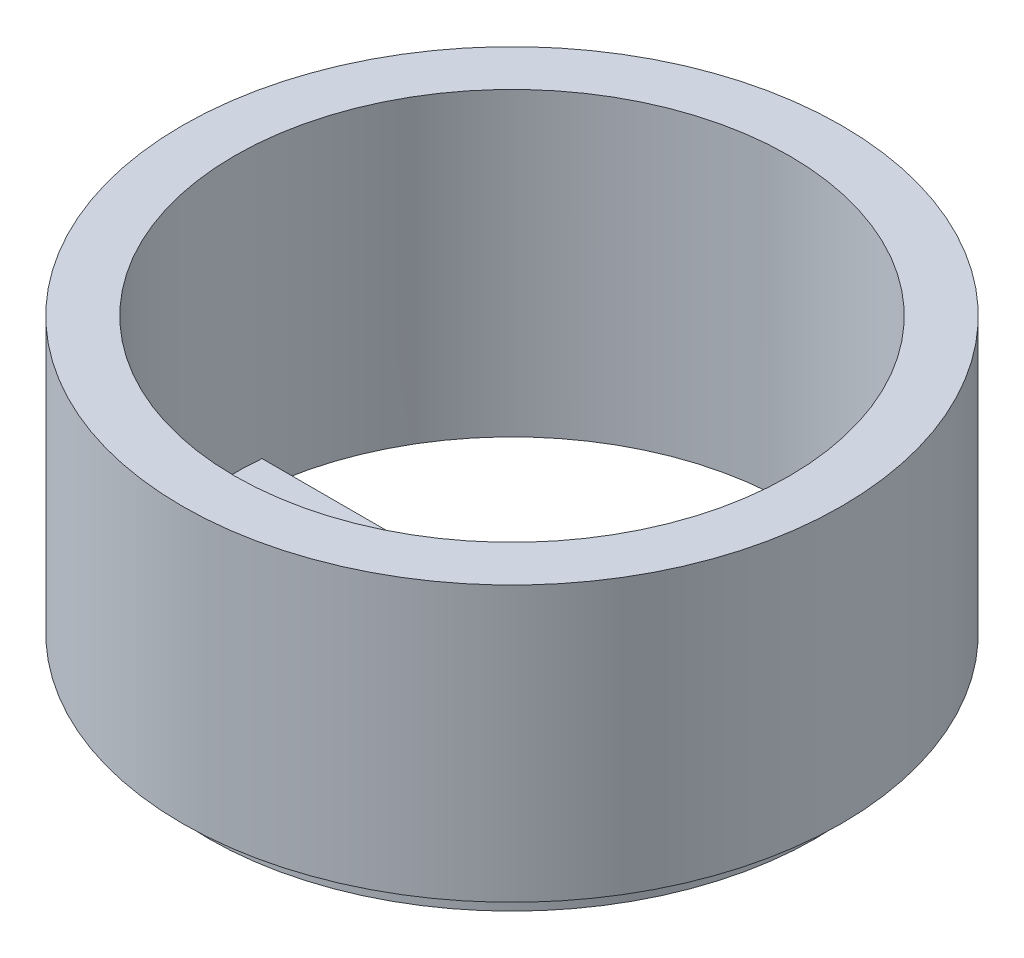
ISO-10303-21;
HEADER;
FILE_DESCRIPTION(('STEP AP214'),'2;1');
FILE_NAME('part.step','',(''),(''),'','','');
FILE_SCHEMA(('AUTOMOTIVE_DESIGN { 1 0 10303 214 1 1 1 1 }'));
ENDSEC;
DATA;
#1=APPLICATION_CONTEXT('core data for automotive mechanical design processes');
#2=APPLICATION_PROTOCOL_DEFINITION('international standard','automotive_design',2000,#1);
#3=PRODUCT_CONTEXT('',#1,'mechanical');
#4=PRODUCT('Part','Part','',(#3));
#5=PRODUCT_RELATED_PRODUCT_CATEGORY('part','',(#4));
#6=PRODUCT_DEFINITION_FORMATION('','',#4);
#7=PRODUCT_DEFINITION_CONTEXT('part definition',#1,'design');
#8=PRODUCT_DEFINITION('design','',#6,#7);
#9=PRODUCT_DEFINITION_SHAPE('','',#8);
#10=(LENGTH_UNIT() NAMED_UNIT(*) SI_UNIT(.MILLI.,.METRE.));
#11=(NAMED_UNIT(*) PLANE_ANGLE_UNIT() SI_UNIT($,.RADIAN.));
#12=(NAMED_UNIT(*) SI_UNIT($,.STERADIAN.) SOLID_ANGLE_UNIT());
#13=UNCERTAINTY_MEASURE_WITH_UNIT(LENGTH_MEASURE(1.E-05),#10,'distance_accuracy_value','');
#14=(GEOMETRIC_REPRESENTATION_CONTEXT(3) GLOBAL_UNCERTAINTY_ASSIGNED_CONTEXT((#13)) GLOBAL_UNIT_ASSIGNED_CONTEXT((#10,
#11,#12)) REPRESENTATION_CONTEXT('',''));
#15=CARTESIAN_POINT('',(0.,0.,0.));
#16=DIRECTION('',(0.,0.,1.));
#17=DIRECTION('',(1.,0.,0.));
#18=AXIS2_PLACEMENT_3D('',#15,#16,#17);
#19=CARTESIAN_POINT('',(33.655,3.175,0.));
#20=DIRECTION('',(0.,1.,0.));
#21=DIRECTION('',(0.,0.,1.));
#22=AXIS2_PLACEMENT_3D('',#19,#20,#21);
#23=PLANE('',#22);
#24=DIRECTION('',(1.,0.,0.));
#25=VECTOR('',#24,1.);
#26=CARTESIAN_POINT('',(-33.5049011340132,3.175,-3.17499999999995));
#27=LINE('',#26,#25);
#28=CARTESIAN_POINT('',(-33.5049011340132,3.175,-3.17499999999995));
#29=VERTEX_POINT('',#28);
#30=CARTESIAN_POINT('',(33.5049011340132,3.175,-3.17499999999999));
#31=VERTEX_POINT('',#30);
#32=EDGE_CURVE('E103',#29,#31,#27,.T.);
#33=ORIENTED_EDGE('',*,*,#32,.F.);
#34=CARTESIAN_POINT('',(0.,3.175,0.));
#35=DIRECTION('',(0.,-1.,0.));
#36=DIRECTION('',(0.,0.,-1.));
#37=AXIS2_PLACEMENT_3D('',#34,#35,#36);
#38=CIRCLE('',#37,33.655);
#39=CARTESIAN_POINT('',(-33.5049011340132,3.175,3.17499999999997));
#40=VERTEX_POINT('',#39);
#41=EDGE_CURVE('E51',#40,#29,#38,.T.);
#42=ORIENTED_EDGE('',*,*,#41,.F.);
#43=DIRECTION('',(-1.,0.,0.));
#44=VECTOR('',#43,1.);
#45=CARTESIAN_POINT('',(-33.5049011340132,3.175,3.17499999999997));
#46=LINE('',#45,#44);
#47=CARTESIAN_POINT('',(33.5049011340132,3.175,3.17499999999997));
#48=VERTEX_POINT('',#47);
#49=EDGE_CURVE('E106',#48,#40,#46,.T.);
#50=ORIENTED_EDGE('',*,*,#49,.F.);
#51=EDGE_CURVE('E12',#31,#48,#38,.T.);
#52=ORIENTED_EDGE('',*,*,#51,.F.);
#53=EDGE_LOOP('',(#33,#42,#50,#52));
#54=FACE_BOUND('',#53,.T.);
#55=ADVANCED_FACE('F43',(#54),#23,.T.);
#56=CARTESIAN_POINT('',(0.,0.,0.));
#57=DIRECTION('',(0.,-1.,0.));
#58=DIRECTION('',(0.,0.,-1.));
#59=AXIS2_PLACEMENT_3D('',#56,#57,#58);
#60=CYLINDRICAL_SURFACE('',#59,33.655);
#61=ORIENTED_EDGE('',*,*,#51,.T.);
#62=DIRECTION('',(0.,1.,0.));
#63=VECTOR('',#62,1.);
#64=CARTESIAN_POINT('',(33.5049011340132,0.,3.17499999999997));
#65=LINE('',#64,#63);
#66=CARTESIAN_POINT('',(33.5049011340132,0.,3.17499999999997));
#67=VERTEX_POINT('',#66);
#68=EDGE_CURVE('E66',#67,#48,#65,.T.);
#69=ORIENTED_EDGE('',*,*,#68,.F.);
#70=CARTESIAN_POINT('',(0.,0.,0.));
#71=DIRECTION('',(0.,1.,0.));
#72=DIRECTION('',(0.,0.,1.));
#73=AXIS2_PLACEMENT_3D('',#70,#71,#72);
#74=CIRCLE('',#73,33.655);
#75=CARTESIAN_POINT('',(-33.5049011340132,0.,3.17499999999997));
#76=VERTEX_POINT('',#75);
#77=EDGE_CURVE('E120',#76,#67,#74,.T.);
#78=ORIENTED_EDGE('',*,*,#77,.F.);
#79=DIRECTION('',(0.,1.,0.));
#80=VECTOR('',#79,1.);
#81=CARTESIAN_POINT('',(-33.5049011340132,0.,3.17499999999997));
#82=LINE('',#81,#80);
#83=EDGE_CURVE('E115',#76,#40,#82,.T.);
#84=ORIENTED_EDGE('',*,*,#83,.T.);
#85=ORIENTED_EDGE('',*,*,#41,.T.);
#86=DIRECTION('',(0.,1.,0.));
#87=VECTOR('',#86,1.);
#88=CARTESIAN_POINT('',(-33.5049011340132,0.,-3.17499999999995));
#89=LINE('',#88,#87);
#90=CARTESIAN_POINT('',(-33.5049011340132,0.,-3.17499999999995));
#91=VERTEX_POINT('',#90);
#92=EDGE_CURVE('E58',#91,#29,#89,.T.);
#93=ORIENTED_EDGE('',*,*,#92,.F.);
#94=CARTESIAN_POINT('',(0.,0.,0.));
#95=DIRECTION('',(0.,1.,0.));
#96=DIRECTION('',(0.,0.,1.));
#97=AXIS2_PLACEMENT_3D('',#94,#95,#96);
#98=CIRCLE('',#97,33.655);
#99=CARTESIAN_POINT('',(33.5049011340132,0.,-3.17499999999999));
#100=VERTEX_POINT('',#99);
#101=EDGE_CURVE('E88',#100,#91,#98,.T.);
#102=ORIENTED_EDGE('',*,*,#101,.F.);
#103=DIRECTION('',(0.,1.,0.));
#104=VECTOR('',#103,1.);
#105=CARTESIAN_POINT('',(33.5049011340132,0.,-3.17499999999999));
#106=LINE('',#105,#104);
#107=EDGE_CURVE('E92',#100,#31,#106,.T.);
#108=ORIENTED_EDGE('',*,*,#107,.T.);
#109=EDGE_LOOP('',(#61,#69,#78,#84,#85,#93,#102,#108));
#110=FACE_BOUND('',#109,.T.);
#111=CARTESIAN_POINT('',(0.,36.5125,0.));
#112=DIRECTION('',(0.,-1.,0.));
#113=DIRECTION('',(0.,0.,-1.));
#114=AXIS2_PLACEMENT_3D('',#111,#112,#113);
#115=CIRCLE('',#114,33.655);
#116=CARTESIAN_POINT('',(0.,36.5125,-33.655));
#117=VERTEX_POINT('',#116);
#118=EDGE_CURVE('E141',#117,#117,#115,.T.);
#119=ORIENTED_EDGE('',*,*,#118,.F.);
#120=EDGE_LOOP('',(#119));
#121=FACE_BOUND('',#120,.T.);
#122=ADVANCED_FACE('F85',(#110,#121),#60,.F.);
#123=CARTESIAN_POINT('',(33.655,36.5125,0.));
#124=DIRECTION('',(0.,1.,0.));
#125=DIRECTION('',(0.,0.,1.));
#126=AXIS2_PLACEMENT_3D('',#123,#124,#125);
#127=PLANE('',#126);
#128=ORIENTED_EDGE('',*,*,#118,.T.);
#129=EDGE_LOOP('',(#128));
#130=FACE_BOUND('',#129,.T.);
#131=CARTESIAN_POINT('',(0.,36.5125,0.));
#132=DIRECTION('',(0.,-1.,0.));
#133=DIRECTION('',(0.,0.,-1.));
#134=AXIS2_PLACEMENT_3D('',#131,#132,#133);
#135=CIRCLE('',#134,40.005);
#136=CARTESIAN_POINT('',(0.,36.5125,-40.005));
#137=VERTEX_POINT('',#136);
#138=EDGE_CURVE('E138',#137,#137,#135,.T.);
#139=ORIENTED_EDGE('',*,*,#138,.F.);
#140=EDGE_LOOP('',(#139));
#141=FACE_BOUND('',#140,.T.);
#142=ADVANCED_FACE('F147',(#130,#141),#127,.T.);
#143=CARTESIAN_POINT('',(0.,0.,0.));
#144=DIRECTION('',(0.,-1.,0.));
#145=DIRECTION('',(0.,0.,-1.));
#146=AXIS2_PLACEMENT_3D('',#143,#144,#145);
#147=CYLINDRICAL_SURFACE('',#146,40.005);
#148=ORIENTED_EDGE('',*,*,#138,.T.);
#149=EDGE_LOOP('',(#148));
#150=FACE_BOUND('',#149,.T.);
#151=CARTESIAN_POINT('',(0.,3.175,0.));
#152=DIRECTION('',(0.,-1.,0.));
#153=DIRECTION('',(0.,0.,-1.));
#154=AXIS2_PLACEMENT_3D('',#151,#152,#153);
#155=CIRCLE('',#154,40.005);
#156=CARTESIAN_POINT('',(0.,3.175,-40.005));
#157=VERTEX_POINT('',#156);
#158=EDGE_CURVE('E134',#157,#157,#155,.T.);
#159=ORIENTED_EDGE('',*,*,#158,.F.);
#160=EDGE_LOOP('',(#159));
#161=FACE_BOUND('',#160,.T.);
#162=ADVANCED_FACE('F154',(#150,#161),#147,.T.);
#163=CARTESIAN_POINT('',(40.005,3.175,0.));
#164=DIRECTION('',(0.,-1.,0.));
#165=DIRECTION('',(0.,0.,-1.));
#166=AXIS2_PLACEMENT_3D('',#163,#164,#165);
#167=PLANE('',#166);
#168=ORIENTED_EDGE('',*,*,#158,.T.);
#169=EDGE_LOOP('',(#168));
#170=FACE_BOUND('',#169,.T.);
#171=CARTESIAN_POINT('',(0.,3.175,0.));
#172=DIRECTION('',(0.,-1.,0.));
#173=DIRECTION('',(0.,0.,-1.));
#174=AXIS2_PLACEMENT_3D('',#171,#172,#173);
#175=CIRCLE('',#174,36.83);
#176=CARTESIAN_POINT('',(0.,3.175,-36.83));
#177=VERTEX_POINT('',#176);
#178=EDGE_CURVE('E130',#177,#177,#175,.T.);
#179=ORIENTED_EDGE('',*,*,#178,.F.);
#180=EDGE_LOOP('',(#179));
#181=FACE_BOUND('',#180,.T.);
#182=ADVANCED_FACE('F160',(#170,#181),#167,.T.);
#183=CARTESIAN_POINT('',(0.,0.,0.));
#184=DIRECTION('',(0.,-1.,0.));
#185=DIRECTION('',(0.,0.,-1.));
#186=AXIS2_PLACEMENT_3D('',#183,#184,#185);
#187=CYLINDRICAL_SURFACE('',#186,36.83);
#188=ORIENTED_EDGE('',*,*,#178,.T.);
#189=EDGE_LOOP('',(#188));
#190=FACE_BOUND('',#189,.T.);
#191=CARTESIAN_POINT('',(0.,0.,0.));
#192=DIRECTION('',(0.,-1.,0.));
#193=DIRECTION('',(0.,0.,-1.));
#194=AXIS2_PLACEMENT_3D('',#191,#192,#193);
#195=CIRCLE('',#194,36.83);
#196=CARTESIAN_POINT('',(0.,0.,-36.83));
#197=VERTEX_POINT('',#196);
#198=EDGE_CURVE('E110',#197,#197,#195,.T.);
#199=ORIENTED_EDGE('',*,*,#198,.F.);
#200=EDGE_LOOP('',(#199));
#201=FACE_BOUND('',#200,.T.);
#202=ADVANCED_FACE('F164',(#190,#201),#187,.T.);
#203=CARTESIAN_POINT('',(36.83,0.,0.));
#204=DIRECTION('',(0.,-1.,0.));
#205=DIRECTION('',(0.,0.,-1.));
#206=AXIS2_PLACEMENT_3D('',#203,#204,#205);
#207=PLANE('',#206);
#208=ORIENTED_EDGE('',*,*,#101,.T.);
#209=DIRECTION('',(1.,0.,0.));
#210=VECTOR('',#209,1.);
#211=CARTESIAN_POINT('',(-33.5049011340132,0.,-3.17499999999995));
#212=LINE('',#211,#210);
#213=EDGE_CURVE('E93',#91,#100,#212,.T.);
#214=ORIENTED_EDGE('',*,*,#213,.T.);
#215=EDGE_LOOP('',(#208,#214));
#216=FACE_BOUND('',#215,.T.);
#217=ORIENTED_EDGE('',*,*,#77,.T.);
#218=DIRECTION('',(-1.,0.,0.));
#219=VECTOR('',#218,1.);
#220=CARTESIAN_POINT('',(-33.5049011340132,0.,3.17499999999997));
#221=LINE('',#220,#219);
#222=EDGE_CURVE('E114',#67,#76,#221,.T.);
#223=ORIENTED_EDGE('',*,*,#222,.T.);
#224=EDGE_LOOP('',(#217,#223));
#225=FACE_BOUND('',#224,.T.);
#226=ORIENTED_EDGE('',*,*,#198,.T.);
#227=EDGE_LOOP('',(#226));
#228=FACE_BOUND('',#227,.T.);
#229=ADVANCED_FACE('F100',(#216,#225,#228),#207,.T.);
#230=CARTESIAN_POINT('',(-33.5049011340132,0.,3.17499999999997));
#231=DIRECTION('',(0.,0.,-1.));
#232=DIRECTION('',(-1.,0.,0.));
#233=AXIS2_PLACEMENT_3D('',#230,#231,#232);
#234=PLANE('',#233);
#235=ORIENTED_EDGE('',*,*,#49,.T.);
#236=ORIENTED_EDGE('',*,*,#83,.F.);
#237=ORIENTED_EDGE('',*,*,#222,.F.);
#238=ORIENTED_EDGE('',*,*,#68,.T.);
#239=EDGE_LOOP('',(#235,#236,#237,#238));
#240=FACE_BOUND('',#239,.T.);
#241=ADVANCED_FACE('F171',(#240),#234,.F.);
#242=CARTESIAN_POINT('',(-33.5049011340132,0.,-3.17499999999995));
#243=DIRECTION('',(0.,0.,1.));
#244=DIRECTION('',(1.,0.,0.));
#245=AXIS2_PLACEMENT_3D('',#242,#243,#244);
#246=PLANE('',#245);
#247=ORIENTED_EDGE('',*,*,#32,.T.);
#248=ORIENTED_EDGE('',*,*,#107,.F.);
#249=ORIENTED_EDGE('',*,*,#213,.F.);
#250=ORIENTED_EDGE('',*,*,#92,.T.);
#251=EDGE_LOOP('',(#247,#248,#249,#250));
#252=FACE_BOUND('',#251,.T.);
#253=ADVANCED_FACE('F96',(#252),#246,.F.);
#254=CLOSED_SHELL('',(#55,#122,#142,#162,#182,#202,#229,#241,#253));
#255=MANIFOLD_SOLID_BREP('B2',#254);
#256=ADVANCED_BREP_SHAPE_REPRESENTATION('',(#18,#255),#14);
#257=SHAPE_DEFINITION_REPRESENTATION(#9,#256);
ENDSEC;
END-ISO-10303-21;
